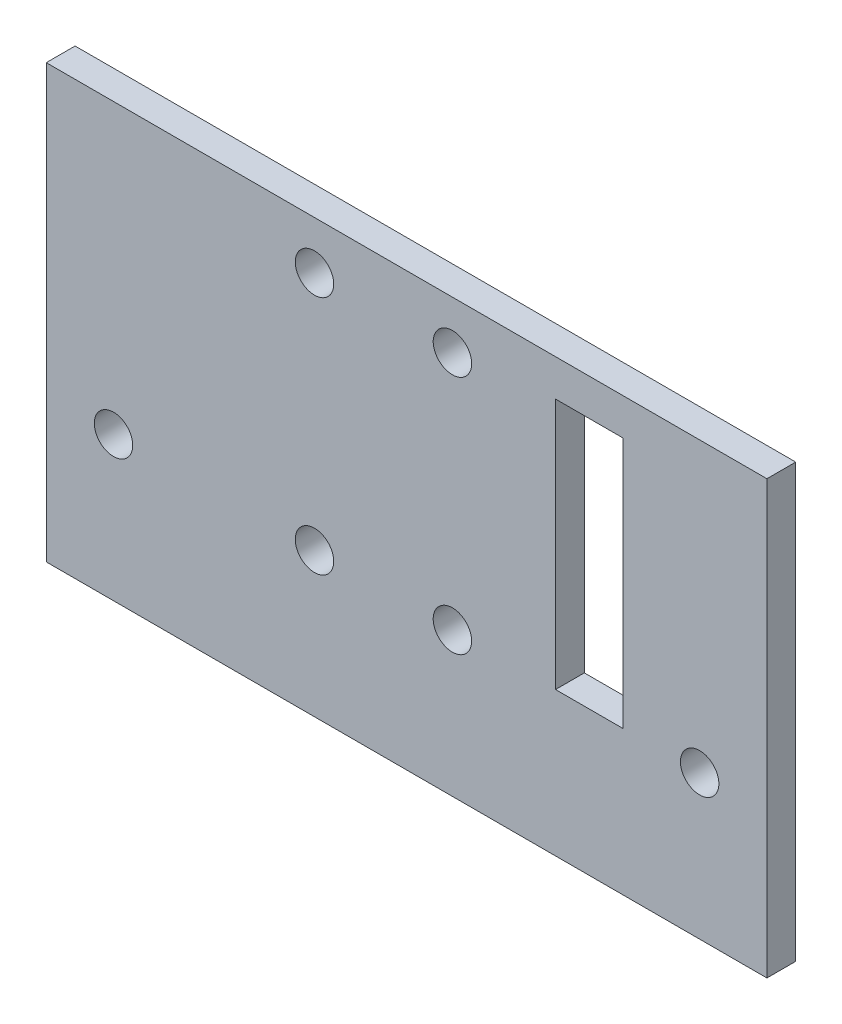
ISO-10303-21;
HEADER;
FILE_DESCRIPTION(('STEP AP214'),'2;1');
FILE_NAME('part.step','',(''),(''),'','','');
FILE_SCHEMA(('AUTOMOTIVE_DESIGN { 1 0 10303 214 1 1 1 1 }'));
ENDSEC;
DATA;
#1=APPLICATION_CONTEXT('core data for automotive mechanical design processes');
#2=APPLICATION_PROTOCOL_DEFINITION('international standard','automotive_design',2000,#1);
#3=PRODUCT_CONTEXT('',#1,'mechanical');
#4=PRODUCT('Part','Part','',(#3));
#5=PRODUCT_RELATED_PRODUCT_CATEGORY('part','',(#4));
#6=PRODUCT_DEFINITION_FORMATION('','',#4);
#7=PRODUCT_DEFINITION_CONTEXT('part definition',#1,'design');
#8=PRODUCT_DEFINITION('design','',#6,#7);
#9=PRODUCT_DEFINITION_SHAPE('','',#8);
#10=(LENGTH_UNIT() NAMED_UNIT(*) SI_UNIT(.MILLI.,.METRE.));
#11=(NAMED_UNIT(*) PLANE_ANGLE_UNIT() SI_UNIT($,.RADIAN.));
#12=(NAMED_UNIT(*) SI_UNIT($,.STERADIAN.) SOLID_ANGLE_UNIT());
#13=UNCERTAINTY_MEASURE_WITH_UNIT(LENGTH_MEASURE(1.E-05),#10,'distance_accuracy_value','');
#14=(GEOMETRIC_REPRESENTATION_CONTEXT(3) GLOBAL_UNCERTAINTY_ASSIGNED_CONTEXT((#13)) GLOBAL_UNIT_ASSIGNED_CONTEXT((#10,
#11,#12)) REPRESENTATION_CONTEXT('',''));
#15=CARTESIAN_POINT('',(0.,0.,0.));
#16=DIRECTION('',(0.,0.,1.));
#17=DIRECTION('',(1.,0.,0.));
#18=AXIS2_PLACEMENT_3D('',#15,#16,#17);
#19=CARTESIAN_POINT('',(0.,0.,3.));
#20=DIRECTION('',(0.,0.,-1.));
#21=DIRECTION('',(-1.,0.,0.));
#22=AXIS2_PLACEMENT_3D('',#19,#20,#21);
#23=PLANE('',#22);
#24=CARTESIAN_POINT('',(30.5,-10.,3.));
#25=DIRECTION('',(0.,0.,1.));
#26=DIRECTION('',(1.,0.,0.));
#27=AXIS2_PLACEMENT_3D('',#24,#25,#26);
#28=CIRCLE('',#27,2.);
#29=CARTESIAN_POINT('',(32.5,-10.,3.));
#30=VERTEX_POINT('',#29);
#31=EDGE_CURVE('E180',#30,#30,#28,.T.);
#32=ORIENTED_EDGE('',*,*,#31,.F.);
#33=EDGE_LOOP('',(#32));
#34=FACE_BOUND('',#33,.T.);
#35=CARTESIAN_POINT('',(-30.5,-10.,3.));
#36=DIRECTION('',(0.,0.,1.));
#37=DIRECTION('',(1.,0.,0.));
#38=AXIS2_PLACEMENT_3D('',#35,#36,#37);
#39=CIRCLE('',#38,2.);
#40=CARTESIAN_POINT('',(-28.5,-10.,3.));
#41=VERTEX_POINT('',#40);
#42=EDGE_CURVE('E186',#41,#41,#39,.T.);
#43=ORIENTED_EDGE('',*,*,#42,.F.);
#44=EDGE_LOOP('',(#43));
#45=FACE_BOUND('',#44,.T.);
#46=DIRECTION('',(0.,1.,0.));
#47=VECTOR('',#46,1.);
#48=CARTESIAN_POINT('',(37.5,-20.,3.));
#49=LINE('',#48,#47);
#50=CARTESIAN_POINT('',(37.5,-25.,3.));
#51=VERTEX_POINT('',#50);
#52=CARTESIAN_POINT('',(37.5,20.,3.));
#53=VERTEX_POINT('',#52);
#54=EDGE_CURVE('E192',#51,#53,#49,.T.);
#55=ORIENTED_EDGE('',*,*,#54,.T.);
#56=DIRECTION('',(-1.,0.,0.));
#57=VECTOR('',#56,1.);
#58=CARTESIAN_POINT('',(-37.5,20.,3.));
#59=LINE('',#58,#57);
#60=CARTESIAN_POINT('',(-37.5,20.,3.));
#61=VERTEX_POINT('',#60);
#62=EDGE_CURVE('E107',#53,#61,#59,.T.);
#63=ORIENTED_EDGE('',*,*,#62,.T.);
#64=DIRECTION('',(0.,-1.,0.));
#65=VECTOR('',#64,1.);
#66=CARTESIAN_POINT('',(-37.5,-20.,3.));
#67=LINE('',#66,#65);
#68=CARTESIAN_POINT('',(-37.5,-25.,3.));
#69=VERTEX_POINT('',#68);
#70=EDGE_CURVE('E101',#61,#69,#67,.T.);
#71=ORIENTED_EDGE('',*,*,#70,.T.);
#72=DIRECTION('',(1.,0.,0.));
#73=VECTOR('',#72,1.);
#74=CARTESIAN_POINT('',(-37.5,-25.,3.));
#75=LINE('',#74,#73);
#76=EDGE_CURVE('E105',#69,#51,#75,.T.);
#77=ORIENTED_EDGE('',*,*,#76,.T.);
#78=EDGE_LOOP('',(#55,#63,#71,#77));
#79=FACE_BOUND('',#78,.T.);
#80=DIRECTION('',(0.,-1.,0.));
#81=VECTOR('',#80,1.);
#82=CARTESIAN_POINT('',(15.5,16.1820385294753,3.));
#83=LINE('',#82,#81);
#84=CARTESIAN_POINT('',(15.5,16.1820385294753,3.));
#85=VERTEX_POINT('',#84);
#86=CARTESIAN_POINT('',(15.5,-10.,3.));
#87=VERTEX_POINT('',#86);
#88=EDGE_CURVE('E154',#85,#87,#83,.T.);
#89=ORIENTED_EDGE('',*,*,#88,.F.);
#90=DIRECTION('',(-1.,0.,0.));
#91=VECTOR('',#90,1.);
#92=CARTESIAN_POINT('',(15.5,16.1820385294753,3.));
#93=LINE('',#92,#91);
#94=CARTESIAN_POINT('',(22.5,16.1820385294753,3.));
#95=VERTEX_POINT('',#94);
#96=EDGE_CURVE('E161',#95,#85,#93,.T.);
#97=ORIENTED_EDGE('',*,*,#96,.F.);
#98=DIRECTION('',(0.,1.,0.));
#99=VECTOR('',#98,1.);
#100=CARTESIAN_POINT('',(22.5,16.1820385294753,3.));
#101=LINE('',#100,#99);
#102=CARTESIAN_POINT('',(22.5,-10.,3.));
#103=VERTEX_POINT('',#102);
#104=EDGE_CURVE('E159',#103,#95,#101,.T.);
#105=ORIENTED_EDGE('',*,*,#104,.F.);
#106=DIRECTION('',(1.,0.,0.));
#107=VECTOR('',#106,1.);
#108=CARTESIAN_POINT('',(15.5,-10.,3.));
#109=LINE('',#108,#107);
#110=EDGE_CURVE('E156',#87,#103,#109,.T.);
#111=ORIENTED_EDGE('',*,*,#110,.F.);
#112=EDGE_LOOP('',(#89,#97,#105,#111));
#113=FACE_BOUND('',#112,.T.);
#114=CARTESIAN_POINT('',(4.77100388514587,15.,3.));
#115=DIRECTION('',(0.,0.,1.));
#116=DIRECTION('',(1.,0.,0.));
#117=AXIS2_PLACEMENT_3D('',#114,#115,#116);
#118=CIRCLE('',#117,2.);
#119=CARTESIAN_POINT('',(6.77100388514587,15.,3.));
#120=VERTEX_POINT('',#119);
#121=EDGE_CURVE('E149',#120,#120,#118,.T.);
#122=ORIENTED_EDGE('',*,*,#121,.F.);
#123=EDGE_LOOP('',(#122));
#124=FACE_BOUND('',#123,.T.);
#125=CARTESIAN_POINT('',(4.77100388514587,-10.,3.));
#126=DIRECTION('',(0.,0.,1.));
#127=DIRECTION('',(1.,0.,0.));
#128=AXIS2_PLACEMENT_3D('',#125,#126,#127);
#129=CIRCLE('',#128,2.);
#130=CARTESIAN_POINT('',(6.77100388514587,-10.,3.));
#131=VERTEX_POINT('',#130);
#132=EDGE_CURVE('E143',#131,#131,#129,.T.);
#133=ORIENTED_EDGE('',*,*,#132,.F.);
#134=EDGE_LOOP('',(#133));
#135=FACE_BOUND('',#134,.T.);
#136=CARTESIAN_POINT('',(-9.58381736800891,-10.,3.));
#137=DIRECTION('',(0.,0.,1.));
#138=DIRECTION('',(1.,0.,0.));
#139=AXIS2_PLACEMENT_3D('',#136,#137,#138);
#140=CIRCLE('',#139,2.);
#141=CARTESIAN_POINT('',(-7.58381736800891,-10.,3.));
#142=VERTEX_POINT('',#141);
#143=EDGE_CURVE('E137',#142,#142,#140,.T.);
#144=ORIENTED_EDGE('',*,*,#143,.F.);
#145=EDGE_LOOP('',(#144));
#146=FACE_BOUND('',#145,.T.);
#147=CARTESIAN_POINT('',(-9.58381736800891,15.,3.));
#148=DIRECTION('',(0.,0.,1.));
#149=DIRECTION('',(1.,0.,0.));
#150=AXIS2_PLACEMENT_3D('',#147,#148,#149);
#151=CIRCLE('',#150,2.);
#152=CARTESIAN_POINT('',(-7.58381736800891,15.,3.));
#153=VERTEX_POINT('',#152);
#154=EDGE_CURVE('E129',#153,#153,#151,.T.);
#155=ORIENTED_EDGE('',*,*,#154,.F.);
#156=EDGE_LOOP('',(#155));
#157=FACE_BOUND('',#156,.T.);
#158=ADVANCED_FACE('F34',(#34,#45,#79,#113,#124,#135,#146,#157),#23,.F.);
#159=CARTESIAN_POINT('',(0.,0.,0.));
#160=DIRECTION('',(0.,0.,-1.));
#161=DIRECTION('',(-1.,0.,0.));
#162=AXIS2_PLACEMENT_3D('',#159,#160,#161);
#163=PLANE('',#162);
#164=CARTESIAN_POINT('',(-9.58381736800891,-10.,0.));
#165=DIRECTION('',(0.,0.,1.));
#166=DIRECTION('',(1.,0.,0.));
#167=AXIS2_PLACEMENT_3D('',#164,#165,#166);
#168=CIRCLE('',#167,2.);
#169=CARTESIAN_POINT('',(-7.58381736800891,-10.,0.));
#170=VERTEX_POINT('',#169);
#171=EDGE_CURVE('E135',#170,#170,#168,.T.);
#172=ORIENTED_EDGE('',*,*,#171,.T.);
#173=EDGE_LOOP('',(#172));
#174=FACE_BOUND('',#173,.T.);
#175=CARTESIAN_POINT('',(4.77100388514587,15.,0.));
#176=DIRECTION('',(0.,0.,1.));
#177=DIRECTION('',(1.,0.,0.));
#178=AXIS2_PLACEMENT_3D('',#175,#176,#177);
#179=CIRCLE('',#178,2.);
#180=CARTESIAN_POINT('',(6.77100388514587,15.,0.));
#181=VERTEX_POINT('',#180);
#182=EDGE_CURVE('E146',#181,#181,#179,.T.);
#183=ORIENTED_EDGE('',*,*,#182,.T.);
#184=EDGE_LOOP('',(#183));
#185=FACE_BOUND('',#184,.T.);
#186=CARTESIAN_POINT('',(-30.5,-10.,0.));
#187=DIRECTION('',(0.,0.,1.));
#188=DIRECTION('',(1.,0.,0.));
#189=AXIS2_PLACEMENT_3D('',#186,#187,#188);
#190=CIRCLE('',#189,2.);
#191=CARTESIAN_POINT('',(-28.5,-10.,0.));
#192=VERTEX_POINT('',#191);
#193=EDGE_CURVE('E183',#192,#192,#190,.T.);
#194=ORIENTED_EDGE('',*,*,#193,.T.);
#195=EDGE_LOOP('',(#194));
#196=FACE_BOUND('',#195,.T.);
#197=DIRECTION('',(0.,1.,0.));
#198=VECTOR('',#197,1.);
#199=CARTESIAN_POINT('',(37.5,-20.,0.));
#200=LINE('',#199,#198);
#201=CARTESIAN_POINT('',(37.5,-25.,0.));
#202=VERTEX_POINT('',#201);
#203=CARTESIAN_POINT('',(37.5,20.,0.));
#204=VERTEX_POINT('',#203);
#205=EDGE_CURVE('E189',#202,#204,#200,.T.);
#206=ORIENTED_EDGE('',*,*,#205,.F.);
#207=DIRECTION('',(1.,0.,0.));
#208=VECTOR('',#207,1.);
#209=CARTESIAN_POINT('',(-37.5,-25.,0.));
#210=LINE('',#209,#208);
#211=CARTESIAN_POINT('',(-37.5,-25.,0.));
#212=VERTEX_POINT('',#211);
#213=EDGE_CURVE('E120',#212,#202,#210,.T.);
#214=ORIENTED_EDGE('',*,*,#213,.F.);
#215=DIRECTION('',(0.,-1.,0.));
#216=VECTOR('',#215,1.);
#217=CARTESIAN_POINT('',(-37.5,-20.,0.));
#218=LINE('',#217,#216);
#219=CARTESIAN_POINT('',(-37.5,20.,0.));
#220=VERTEX_POINT('',#219);
#221=EDGE_CURVE('E124',#220,#212,#218,.T.);
#222=ORIENTED_EDGE('',*,*,#221,.F.);
#223=DIRECTION('',(-1.,0.,0.));
#224=VECTOR('',#223,1.);
#225=CARTESIAN_POINT('',(-37.5,20.,0.));
#226=LINE('',#225,#224);
#227=EDGE_CURVE('E197',#204,#220,#226,.T.);
#228=ORIENTED_EDGE('',*,*,#227,.F.);
#229=EDGE_LOOP('',(#206,#214,#222,#228));
#230=FACE_BOUND('',#229,.T.);
#231=CARTESIAN_POINT('',(30.5,-10.,0.));
#232=DIRECTION('',(0.,0.,1.));
#233=DIRECTION('',(1.,0.,0.));
#234=AXIS2_PLACEMENT_3D('',#231,#232,#233);
#235=CIRCLE('',#234,2.);
#236=CARTESIAN_POINT('',(32.5,-10.,0.));
#237=VERTEX_POINT('',#236);
#238=EDGE_CURVE('E179',#237,#237,#235,.T.);
#239=ORIENTED_EDGE('',*,*,#238,.T.);
#240=EDGE_LOOP('',(#239));
#241=FACE_BOUND('',#240,.T.);
#242=DIRECTION('',(-1.,0.,0.));
#243=VECTOR('',#242,1.);
#244=CARTESIAN_POINT('',(15.5,16.1820385294753,0.));
#245=LINE('',#244,#243);
#246=CARTESIAN_POINT('',(22.5,16.1820385294753,0.));
#247=VERTEX_POINT('',#246);
#248=CARTESIAN_POINT('',(15.5,16.1820385294753,0.));
#249=VERTEX_POINT('',#248);
#250=EDGE_CURVE('E157',#247,#249,#245,.T.);
#251=ORIENTED_EDGE('',*,*,#250,.T.);
#252=DIRECTION('',(0.,-1.,0.));
#253=VECTOR('',#252,1.);
#254=CARTESIAN_POINT('',(15.5,16.1820385294753,0.));
#255=LINE('',#254,#253);
#256=CARTESIAN_POINT('',(15.5,-10.,0.));
#257=VERTEX_POINT('',#256);
#258=EDGE_CURVE('E57',#249,#257,#255,.T.);
#259=ORIENTED_EDGE('',*,*,#258,.T.);
#260=DIRECTION('',(1.,0.,0.));
#261=VECTOR('',#260,1.);
#262=CARTESIAN_POINT('',(15.5,-10.,0.));
#263=LINE('',#262,#261);
#264=CARTESIAN_POINT('',(22.5,-10.,0.));
#265=VERTEX_POINT('',#264);
#266=EDGE_CURVE('E165',#257,#265,#263,.T.);
#267=ORIENTED_EDGE('',*,*,#266,.T.);
#268=DIRECTION('',(0.,1.,0.));
#269=VECTOR('',#268,1.);
#270=CARTESIAN_POINT('',(22.5,16.1820385294753,0.));
#271=LINE('',#270,#269);
#272=EDGE_CURVE('E168',#265,#247,#271,.T.);
#273=ORIENTED_EDGE('',*,*,#272,.T.);
#274=EDGE_LOOP('',(#251,#259,#267,#273));
#275=FACE_BOUND('',#274,.T.);
#276=CARTESIAN_POINT('',(4.77100388514587,-10.,0.));
#277=DIRECTION('',(0.,0.,1.));
#278=DIRECTION('',(1.,0.,0.));
#279=AXIS2_PLACEMENT_3D('',#276,#277,#278);
#280=CIRCLE('',#279,2.);
#281=CARTESIAN_POINT('',(6.77100388514587,-10.,0.));
#282=VERTEX_POINT('',#281);
#283=EDGE_CURVE('E140',#282,#282,#280,.T.);
#284=ORIENTED_EDGE('',*,*,#283,.T.);
#285=EDGE_LOOP('',(#284));
#286=FACE_BOUND('',#285,.T.);
#287=CARTESIAN_POINT('',(-9.58381736800891,15.,0.));
#288=DIRECTION('',(0.,0.,1.));
#289=DIRECTION('',(1.,0.,0.));
#290=AXIS2_PLACEMENT_3D('',#287,#288,#289);
#291=CIRCLE('',#290,2.);
#292=CARTESIAN_POINT('',(-7.58381736800891,15.,0.));
#293=VERTEX_POINT('',#292);
#294=EDGE_CURVE('E126',#293,#293,#291,.T.);
#295=ORIENTED_EDGE('',*,*,#294,.T.);
#296=EDGE_LOOP('',(#295));
#297=FACE_BOUND('',#296,.T.);
#298=ADVANCED_FACE('F201',(#174,#185,#196,#230,#241,#275,#286,#297),#163,.T.);
#299=CARTESIAN_POINT('',(37.5,-20.,3.));
#300=DIRECTION('',(-1.,0.,0.));
#301=DIRECTION('',(0.,0.,1.));
#302=AXIS2_PLACEMENT_3D('',#299,#300,#301);
#303=PLANE('',#302);
#304=ORIENTED_EDGE('',*,*,#205,.T.);
#305=DIRECTION('',(0.,0.,-1.));
#306=VECTOR('',#305,1.);
#307=CARTESIAN_POINT('',(37.5,20.,3.));
#308=LINE('',#307,#306);
#309=EDGE_CURVE('E11',#53,#204,#308,.T.);
#310=ORIENTED_EDGE('',*,*,#309,.F.);
#311=ORIENTED_EDGE('',*,*,#54,.F.);
#312=DIRECTION('',(0.,0.,-1.));
#313=VECTOR('',#312,1.);
#314=CARTESIAN_POINT('',(37.5,-25.,3.));
#315=LINE('',#314,#313);
#316=EDGE_CURVE('E119',#51,#202,#315,.T.);
#317=ORIENTED_EDGE('',*,*,#316,.T.);
#318=EDGE_LOOP('',(#304,#310,#311,#317));
#319=FACE_BOUND('',#318,.T.);
#320=ADVANCED_FACE('F36',(#319),#303,.F.);
#321=CARTESIAN_POINT('',(-37.5,20.,3.));
#322=DIRECTION('',(0.,-1.,0.));
#323=DIRECTION('',(0.,0.,-1.));
#324=AXIS2_PLACEMENT_3D('',#321,#322,#323);
#325=PLANE('',#324);
#326=ORIENTED_EDGE('',*,*,#227,.T.);
#327=DIRECTION('',(0.,0.,-1.));
#328=VECTOR('',#327,1.);
#329=CARTESIAN_POINT('',(-37.5,20.,3.));
#330=LINE('',#329,#328);
#331=EDGE_CURVE('E42',#61,#220,#330,.T.);
#332=ORIENTED_EDGE('',*,*,#331,.F.);
#333=ORIENTED_EDGE('',*,*,#62,.F.);
#334=ORIENTED_EDGE('',*,*,#309,.T.);
#335=EDGE_LOOP('',(#326,#332,#333,#334));
#336=FACE_BOUND('',#335,.T.);
#337=ADVANCED_FACE('F205',(#336),#325,.F.);
#338=CARTESIAN_POINT('',(-37.5,-20.,3.));
#339=DIRECTION('',(1.,0.,0.));
#340=DIRECTION('',(0.,0.,-1.));
#341=AXIS2_PLACEMENT_3D('',#338,#339,#340);
#342=PLANE('',#341);
#343=ORIENTED_EDGE('',*,*,#221,.T.);
#344=DIRECTION('',(0.,0.,-1.));
#345=VECTOR('',#344,1.);
#346=CARTESIAN_POINT('',(-37.5,-25.,3.));
#347=LINE('',#346,#345);
#348=EDGE_CURVE('E117',#69,#212,#347,.T.);
#349=ORIENTED_EDGE('',*,*,#348,.F.);
#350=ORIENTED_EDGE('',*,*,#70,.F.);
#351=ORIENTED_EDGE('',*,*,#331,.T.);
#352=EDGE_LOOP('',(#343,#349,#350,#351));
#353=FACE_BOUND('',#352,.T.);
#354=ADVANCED_FACE('F122',(#353),#342,.F.);
#355=CARTESIAN_POINT('',(-30.5,-10.,3.));
#356=DIRECTION('',(0.,0.,-1.));
#357=DIRECTION('',(-1.,0.,0.));
#358=AXIS2_PLACEMENT_3D('',#355,#356,#357);
#359=CYLINDRICAL_SURFACE('',#358,2.);
#360=ORIENTED_EDGE('',*,*,#42,.T.);
#361=EDGE_LOOP('',(#360));
#362=FACE_BOUND('',#361,.T.);
#363=ORIENTED_EDGE('',*,*,#193,.F.);
#364=EDGE_LOOP('',(#363));
#365=FACE_BOUND('',#364,.T.);
#366=ADVANCED_FACE('F211',(#362,#365),#359,.F.);
#367=CARTESIAN_POINT('',(30.5,-10.,3.));
#368=DIRECTION('',(0.,0.,-1.));
#369=DIRECTION('',(-1.,0.,0.));
#370=AXIS2_PLACEMENT_3D('',#367,#368,#369);
#371=CYLINDRICAL_SURFACE('',#370,2.);
#372=ORIENTED_EDGE('',*,*,#31,.T.);
#373=EDGE_LOOP('',(#372));
#374=FACE_BOUND('',#373,.T.);
#375=ORIENTED_EDGE('',*,*,#238,.F.);
#376=EDGE_LOOP('',(#375));
#377=FACE_BOUND('',#376,.T.);
#378=ADVANCED_FACE('F226',(#374,#377),#371,.F.);
#379=CARTESIAN_POINT('',(15.5,16.1820385294753,3.));
#380=DIRECTION('',(1.,0.,0.));
#381=DIRECTION('',(0.,1.,0.));
#382=AXIS2_PLACEMENT_3D('',#379,#380,#381);
#383=PLANE('',#382);
#384=ORIENTED_EDGE('',*,*,#258,.F.);
#385=DIRECTION('',(0.,0.,-1.));
#386=VECTOR('',#385,1.);
#387=CARTESIAN_POINT('',(15.5,16.1820385294753,3.));
#388=LINE('',#387,#386);
#389=EDGE_CURVE('E163',#85,#249,#388,.T.);
#390=ORIENTED_EDGE('',*,*,#389,.F.);
#391=ORIENTED_EDGE('',*,*,#88,.T.);
#392=DIRECTION('',(0.,0.,-1.));
#393=VECTOR('',#392,1.);
#394=CARTESIAN_POINT('',(15.5,-10.,3.));
#395=LINE('',#394,#393);
#396=EDGE_CURVE('E177',#87,#257,#395,.T.);
#397=ORIENTED_EDGE('',*,*,#396,.T.);
#398=EDGE_LOOP('',(#384,#390,#391,#397));
#399=FACE_BOUND('',#398,.T.);
#400=ADVANCED_FACE('F230',(#399),#383,.T.);
#401=CARTESIAN_POINT('',(15.5,-10.,3.));
#402=DIRECTION('',(0.,1.,0.));
#403=DIRECTION('',(-1.,0.,0.));
#404=AXIS2_PLACEMENT_3D('',#401,#402,#403);
#405=PLANE('',#404);
#406=ORIENTED_EDGE('',*,*,#266,.F.);
#407=ORIENTED_EDGE('',*,*,#396,.F.);
#408=ORIENTED_EDGE('',*,*,#110,.T.);
#409=DIRECTION('',(0.,0.,-1.));
#410=VECTOR('',#409,1.);
#411=CARTESIAN_POINT('',(22.5,-10.,3.));
#412=LINE('',#411,#410);
#413=EDGE_CURVE('E175',#103,#265,#412,.T.);
#414=ORIENTED_EDGE('',*,*,#413,.T.);
#415=EDGE_LOOP('',(#406,#407,#408,#414));
#416=FACE_BOUND('',#415,.T.);
#417=ADVANCED_FACE('F234',(#416),#405,.T.);
#418=CARTESIAN_POINT('',(22.5,16.1820385294753,3.));
#419=DIRECTION('',(-1.,0.,0.));
#420=DIRECTION('',(0.,-1.,0.));
#421=AXIS2_PLACEMENT_3D('',#418,#419,#420);
#422=PLANE('',#421);
#423=ORIENTED_EDGE('',*,*,#272,.F.);
#424=ORIENTED_EDGE('',*,*,#413,.F.);
#425=ORIENTED_EDGE('',*,*,#104,.T.);
#426=DIRECTION('',(0.,0.,-1.));
#427=VECTOR('',#426,1.);
#428=CARTESIAN_POINT('',(22.5,16.1820385294753,3.));
#429=LINE('',#428,#427);
#430=EDGE_CURVE('E49',#95,#247,#429,.T.);
#431=ORIENTED_EDGE('',*,*,#430,.T.);
#432=EDGE_LOOP('',(#423,#424,#425,#431));
#433=FACE_BOUND('',#432,.T.);
#434=ADVANCED_FACE('F237',(#433),#422,.T.);
#435=CARTESIAN_POINT('',(15.5,16.1820385294753,3.));
#436=DIRECTION('',(0.,-1.,0.));
#437=DIRECTION('',(1.,0.,0.));
#438=AXIS2_PLACEMENT_3D('',#435,#436,#437);
#439=PLANE('',#438);
#440=ORIENTED_EDGE('',*,*,#250,.F.);
#441=ORIENTED_EDGE('',*,*,#430,.F.);
#442=ORIENTED_EDGE('',*,*,#96,.T.);
#443=ORIENTED_EDGE('',*,*,#389,.T.);
#444=EDGE_LOOP('',(#440,#441,#442,#443));
#445=FACE_BOUND('',#444,.T.);
#446=ADVANCED_FACE('F241',(#445),#439,.T.);
#447=CARTESIAN_POINT('',(4.77100388514587,15.,3.));
#448=DIRECTION('',(0.,0.,-1.));
#449=DIRECTION('',(-1.,0.,0.));
#450=AXIS2_PLACEMENT_3D('',#447,#448,#449);
#451=CYLINDRICAL_SURFACE('',#450,2.);
#452=ORIENTED_EDGE('',*,*,#121,.T.);
#453=EDGE_LOOP('',(#452));
#454=FACE_BOUND('',#453,.T.);
#455=ORIENTED_EDGE('',*,*,#182,.F.);
#456=EDGE_LOOP('',(#455));
#457=FACE_BOUND('',#456,.T.);
#458=ADVANCED_FACE('F245',(#454,#457),#451,.F.);
#459=CARTESIAN_POINT('',(4.77100388514587,-10.,3.));
#460=DIRECTION('',(0.,0.,-1.));
#461=DIRECTION('',(-1.,0.,0.));
#462=AXIS2_PLACEMENT_3D('',#459,#460,#461);
#463=CYLINDRICAL_SURFACE('',#462,2.);
#464=ORIENTED_EDGE('',*,*,#132,.T.);
#465=EDGE_LOOP('',(#464));
#466=FACE_BOUND('',#465,.T.);
#467=ORIENTED_EDGE('',*,*,#283,.F.);
#468=EDGE_LOOP('',(#467));
#469=FACE_BOUND('',#468,.T.);
#470=ADVANCED_FACE('F248',(#466,#469),#463,.F.);
#471=CARTESIAN_POINT('',(-9.58381736800891,-10.,3.));
#472=DIRECTION('',(0.,0.,-1.));
#473=DIRECTION('',(-1.,0.,0.));
#474=AXIS2_PLACEMENT_3D('',#471,#472,#473);
#475=CYLINDRICAL_SURFACE('',#474,2.);
#476=ORIENTED_EDGE('',*,*,#143,.T.);
#477=EDGE_LOOP('',(#476));
#478=FACE_BOUND('',#477,.T.);
#479=ORIENTED_EDGE('',*,*,#171,.F.);
#480=EDGE_LOOP('',(#479));
#481=FACE_BOUND('',#480,.T.);
#482=ADVANCED_FACE('F252',(#478,#481),#475,.F.);
#483=CARTESIAN_POINT('',(-9.58381736800891,15.,3.));
#484=DIRECTION('',(0.,0.,-1.));
#485=DIRECTION('',(-1.,0.,0.));
#486=AXIS2_PLACEMENT_3D('',#483,#484,#485);
#487=CYLINDRICAL_SURFACE('',#486,2.);
#488=ORIENTED_EDGE('',*,*,#154,.T.);
#489=EDGE_LOOP('',(#488));
#490=FACE_BOUND('',#489,.T.);
#491=ORIENTED_EDGE('',*,*,#294,.F.);
#492=EDGE_LOOP('',(#491));
#493=FACE_BOUND('',#492,.T.);
#494=ADVANCED_FACE('F256',(#490,#493),#487,.F.);
#495=CARTESIAN_POINT('',(-37.5,-25.,3.));
#496=DIRECTION('',(0.,1.,0.));
#497=DIRECTION('',(0.,0.,1.));
#498=AXIS2_PLACEMENT_3D('',#495,#496,#497);
#499=PLANE('',#498);
#500=ORIENTED_EDGE('',*,*,#213,.T.);
#501=ORIENTED_EDGE('',*,*,#316,.F.);
#502=ORIENTED_EDGE('',*,*,#76,.F.);
#503=ORIENTED_EDGE('',*,*,#348,.T.);
#504=EDGE_LOOP('',(#500,#501,#502,#503));
#505=FACE_BOUND('',#504,.T.);
#506=ADVANCED_FACE('F116',(#505),#499,.F.);
#507=CLOSED_SHELL('',(#158,#298,#320,#337,#354,#366,#378,#400,#417,#434,#446,#458,#470,#482,
#494,#506));
#508=MANIFOLD_SOLID_BREP('B2',#507);
#509=ADVANCED_BREP_SHAPE_REPRESENTATION('',(#18,#508),#14);
#510=SHAPE_DEFINITION_REPRESENTATION(#9,#509);
ENDSEC;
END-ISO-10303-21;
